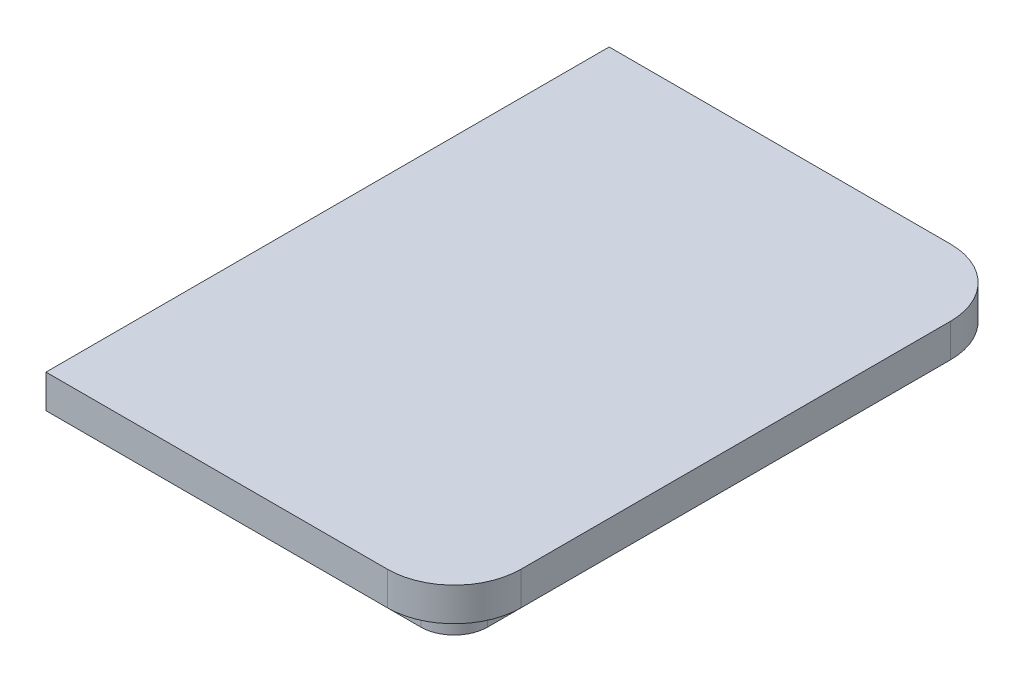
ISO-10303-21;
HEADER;
FILE_DESCRIPTION(('STEP AP214'),'2;1');
FILE_NAME('part.step','',(''),(''),'','','');
FILE_SCHEMA(('AUTOMOTIVE_DESIGN { 1 0 10303 214 1 1 1 1 }'));
ENDSEC;
DATA;
#1=APPLICATION_CONTEXT('core data for automotive mechanical design processes');
#2=APPLICATION_PROTOCOL_DEFINITION('international standard','automotive_design',2000,#1);
#3=PRODUCT_CONTEXT('',#1,'mechanical');
#4=PRODUCT('Part','Part','',(#3));
#5=PRODUCT_RELATED_PRODUCT_CATEGORY('part','',(#4));
#6=PRODUCT_DEFINITION_FORMATION('','',#4);
#7=PRODUCT_DEFINITION_CONTEXT('part definition',#1,'design');
#8=PRODUCT_DEFINITION('design','',#6,#7);
#9=PRODUCT_DEFINITION_SHAPE('','',#8);
#10=(LENGTH_UNIT() NAMED_UNIT(*) SI_UNIT(.MILLI.,.METRE.));
#11=(NAMED_UNIT(*) PLANE_ANGLE_UNIT() SI_UNIT($,.RADIAN.));
#12=(NAMED_UNIT(*) SI_UNIT($,.STERADIAN.) SOLID_ANGLE_UNIT());
#13=UNCERTAINTY_MEASURE_WITH_UNIT(LENGTH_MEASURE(1.E-05),#10,'distance_accuracy_value','');
#14=(GEOMETRIC_REPRESENTATION_CONTEXT(3) GLOBAL_UNCERTAINTY_ASSIGNED_CONTEXT((#13)) GLOBAL_UNIT_ASSIGNED_CONTEXT((#10,
#11,#12)) REPRESENTATION_CONTEXT('',''));
#15=CARTESIAN_POINT('',(0.,0.,0.));
#16=DIRECTION('',(0.,0.,1.));
#17=DIRECTION('',(1.,0.,0.));
#18=AXIS2_PLACEMENT_3D('',#15,#16,#17);
#19=CARTESIAN_POINT('',(20.5,0.,-32.075));
#20=DIRECTION('',(0.,1.,0.));
#21=DIRECTION('',(0.,0.,1.));
#22=AXIS2_PLACEMENT_3D('',#19,#20,#21);
#23=PLANE('',#22);
#24=DIRECTION('',(0.,0.,1.));
#25=VECTOR('',#24,1.);
#26=CARTESIAN_POINT('',(-30.5,0.,42.075));
#27=LINE('',#26,#25);
#28=CARTESIAN_POINT('',(-30.5,0.,37.075));
#29=VERTEX_POINT('',#28);
#30=CARTESIAN_POINT('',(-30.5,0.,42.075));
#31=VERTEX_POINT('',#30);
#32=EDGE_CURVE('E153',#29,#31,#27,.T.);
#33=ORIENTED_EDGE('',*,*,#32,.F.);
#34=DIRECTION('',(1.,0.,0.));
#35=VECTOR('',#34,1.);
#36=CARTESIAN_POINT('',(-30.5,0.,37.075));
#37=LINE('',#36,#35);
#38=CARTESIAN_POINT('',(20.5,0.,37.075));
#39=VERTEX_POINT('',#38);
#40=EDGE_CURVE('E258',#29,#39,#37,.T.);
#41=ORIENTED_EDGE('',*,*,#40,.T.);
#42=CARTESIAN_POINT('',(20.5,0.,32.075));
#43=DIRECTION('',(0.,1.,0.));
#44=DIRECTION('',(0.,0.,1.));
#45=AXIS2_PLACEMENT_3D('',#42,#43,#44);
#46=CIRCLE('',#45,5.);
#47=CARTESIAN_POINT('',(25.5,0.,32.075));
#48=VERTEX_POINT('',#47);
#49=EDGE_CURVE('E254',#39,#48,#46,.T.);
#50=ORIENTED_EDGE('',*,*,#49,.T.);
#51=DIRECTION('',(0.,0.,-1.));
#52=VECTOR('',#51,1.);
#53=CARTESIAN_POINT('',(25.5,0.,32.075));
#54=LINE('',#53,#52);
#55=CARTESIAN_POINT('',(25.5,0.,-32.075));
#56=VERTEX_POINT('',#55);
#57=EDGE_CURVE('E250',#48,#56,#54,.T.);
#58=ORIENTED_EDGE('',*,*,#57,.T.);
#59=CARTESIAN_POINT('',(20.5,0.,-32.075));
#60=DIRECTION('',(0.,1.,0.));
#61=DIRECTION('',(0.,0.,1.));
#62=AXIS2_PLACEMENT_3D('',#59,#60,#61);
#63=CIRCLE('',#62,5.);
#64=CARTESIAN_POINT('',(20.5,0.,-37.075));
#65=VERTEX_POINT('',#64);
#66=EDGE_CURVE('E246',#56,#65,#63,.T.);
#67=ORIENTED_EDGE('',*,*,#66,.T.);
#68=DIRECTION('',(-1.,0.,0.));
#69=VECTOR('',#68,1.);
#70=CARTESIAN_POINT('',(20.5,0.,-37.075));
#71=LINE('',#70,#69);
#72=CARTESIAN_POINT('',(-30.5,0.,-37.075));
#73=VERTEX_POINT('',#72);
#74=EDGE_CURVE('E242',#65,#73,#71,.T.);
#75=ORIENTED_EDGE('',*,*,#74,.T.);
#76=CARTESIAN_POINT('',(-30.5,0.,-42.075));
#77=VERTEX_POINT('',#76);
#78=EDGE_CURVE('E147',#77,#73,#27,.T.);
#79=ORIENTED_EDGE('',*,*,#78,.F.);
#80=DIRECTION('',(-1.,0.,0.));
#81=VECTOR('',#80,1.);
#82=CARTESIAN_POINT('',(-30.5,0.,-42.075));
#83=LINE('',#82,#81);
#84=CARTESIAN_POINT('',(20.5,0.,-42.075));
#85=VERTEX_POINT('',#84);
#86=EDGE_CURVE('E97',#85,#77,#83,.T.);
#87=ORIENTED_EDGE('',*,*,#86,.F.);
#88=CARTESIAN_POINT('',(20.5,0.,-32.075));
#89=DIRECTION('',(0.,1.,0.));
#90=DIRECTION('',(0.,0.,1.));
#91=AXIS2_PLACEMENT_3D('',#88,#89,#90);
#92=CIRCLE('',#91,10.);
#93=CARTESIAN_POINT('',(30.5,0.,-32.075));
#94=VERTEX_POINT('',#93);
#95=EDGE_CURVE('E161',#94,#85,#92,.T.);
#96=ORIENTED_EDGE('',*,*,#95,.F.);
#97=DIRECTION('',(0.,0.,-1.));
#98=VECTOR('',#97,1.);
#99=CARTESIAN_POINT('',(30.5,0.,32.075));
#100=LINE('',#99,#98);
#101=CARTESIAN_POINT('',(30.5,0.,32.075));
#102=VERTEX_POINT('',#101);
#103=EDGE_CURVE('E132',#102,#94,#100,.T.);
#104=ORIENTED_EDGE('',*,*,#103,.F.);
#105=CARTESIAN_POINT('',(20.5,0.,32.075));
#106=DIRECTION('',(0.,1.,0.));
#107=DIRECTION('',(0.,0.,1.));
#108=AXIS2_PLACEMENT_3D('',#105,#106,#107);
#109=CIRCLE('',#108,10.);
#110=CARTESIAN_POINT('',(20.5,0.,42.075));
#111=VERTEX_POINT('',#110);
#112=EDGE_CURVE('E156',#111,#102,#109,.T.);
#113=ORIENTED_EDGE('',*,*,#112,.F.);
#114=DIRECTION('',(1.,0.,0.));
#115=VECTOR('',#114,1.);
#116=CARTESIAN_POINT('',(-30.5,0.,42.075));
#117=LINE('',#116,#115);
#118=EDGE_CURVE('E151',#31,#111,#117,.T.);
#119=ORIENTED_EDGE('',*,*,#118,.F.);
#120=EDGE_LOOP('',(#33,#41,#50,#58,#67,#75,#79,#87,#96,#104,#113,#119));
#121=FACE_BOUND('',#120,.T.);
#122=ADVANCED_FACE('F45',(#121),#23,.F.);
#123=CARTESIAN_POINT('',(-30.5,5.,42.075));
#124=DIRECTION('',(1.,0.,0.));
#125=DIRECTION('',(0.,0.,-1.));
#126=AXIS2_PLACEMENT_3D('',#123,#124,#125);
#127=PLANE('',#126);
#128=ORIENTED_EDGE('',*,*,#78,.T.);
#129=DIRECTION('',(0.,1.,0.));
#130=VECTOR('',#129,1.);
#131=CARTESIAN_POINT('',(-30.5,-5.,-37.075));
#132=LINE('',#131,#130);
#133=CARTESIAN_POINT('',(-30.5,-5.,-37.075));
#134=VERTEX_POINT('',#133);
#135=EDGE_CURVE('E212',#134,#73,#132,.T.);
#136=ORIENTED_EDGE('',*,*,#135,.F.);
#137=DIRECTION('',(0.,0.,1.));
#138=VECTOR('',#137,1.);
#139=CARTESIAN_POINT('',(-30.5,-5.,-37.075));
#140=LINE('',#139,#138);
#141=CARTESIAN_POINT('',(-30.5,-5.,-32.075));
#142=VERTEX_POINT('',#141);
#143=EDGE_CURVE('E272',#134,#142,#140,.T.);
#144=ORIENTED_EDGE('',*,*,#143,.T.);
#145=DIRECTION('',(0.,1.,0.));
#146=VECTOR('',#145,1.);
#147=CARTESIAN_POINT('',(-30.5,-5.,-32.075));
#148=LINE('',#147,#146);
#149=CARTESIAN_POINT('',(-30.5,0.,-32.075));
#150=VERTEX_POINT('',#149);
#151=EDGE_CURVE('E216',#142,#150,#148,.T.);
#152=ORIENTED_EDGE('',*,*,#151,.T.);
#153=CARTESIAN_POINT('',(-30.5,0.,32.075));
#154=VERTEX_POINT('',#153);
#155=EDGE_CURVE('E152',#150,#154,#27,.T.);
#156=ORIENTED_EDGE('',*,*,#155,.T.);
#157=DIRECTION('',(0.,1.,0.));
#158=VECTOR('',#157,1.);
#159=CARTESIAN_POINT('',(-30.5,-5.,32.075));
#160=LINE('',#159,#158);
#161=CARTESIAN_POINT('',(-30.5,-5.,32.075));
#162=VERTEX_POINT('',#161);
#163=EDGE_CURVE('E61',#162,#154,#160,.T.);
#164=ORIENTED_EDGE('',*,*,#163,.F.);
#165=DIRECTION('',(0.,0.,1.));
#166=VECTOR('',#165,1.);
#167=CARTESIAN_POINT('',(-30.5,-5.,32.075));
#168=LINE('',#167,#166);
#169=CARTESIAN_POINT('',(-30.5,-5.,37.075));
#170=VERTEX_POINT('',#169);
#171=EDGE_CURVE('E233',#162,#170,#168,.T.);
#172=ORIENTED_EDGE('',*,*,#171,.T.);
#173=DIRECTION('',(0.,1.,0.));
#174=VECTOR('',#173,1.);
#175=CARTESIAN_POINT('',(-30.5,-5.,37.075));
#176=LINE('',#175,#174);
#177=EDGE_CURVE('E190',#170,#29,#176,.T.);
#178=ORIENTED_EDGE('',*,*,#177,.T.);
#179=ORIENTED_EDGE('',*,*,#32,.T.);
#180=DIRECTION('',(0.,-1.,0.));
#181=VECTOR('',#180,1.);
#182=CARTESIAN_POINT('',(-30.5,5.,42.075));
#183=LINE('',#182,#181);
#184=CARTESIAN_POINT('',(-30.5,5.,42.075));
#185=VERTEX_POINT('',#184);
#186=EDGE_CURVE('E11',#185,#31,#183,.T.);
#187=ORIENTED_EDGE('',*,*,#186,.F.);
#188=DIRECTION('',(0.,0.,1.));
#189=VECTOR('',#188,1.);
#190=CARTESIAN_POINT('',(-30.5,5.,42.075));
#191=LINE('',#190,#189);
#192=CARTESIAN_POINT('',(-30.5,5.,-42.075));
#193=VERTEX_POINT('',#192);
#194=EDGE_CURVE('E166',#193,#185,#191,.T.);
#195=ORIENTED_EDGE('',*,*,#194,.F.);
#196=DIRECTION('',(0.,-1.,0.));
#197=VECTOR('',#196,1.);
#198=CARTESIAN_POINT('',(-30.5,5.,-42.075));
#199=LINE('',#198,#197);
#200=EDGE_CURVE('E143',#193,#77,#199,.T.);
#201=ORIENTED_EDGE('',*,*,#200,.T.);
#202=EDGE_LOOP('',(#128,#136,#144,#152,#156,#164,#172,#178,#179,#187,#195,#201));
#203=FACE_BOUND('',#202,.T.);
#204=ADVANCED_FACE('F47',(#203),#127,.F.);
#205=CARTESIAN_POINT('',(-30.5,5.,42.075));
#206=DIRECTION('',(0.,0.,-1.));
#207=DIRECTION('',(-1.,0.,0.));
#208=AXIS2_PLACEMENT_3D('',#205,#206,#207);
#209=PLANE('',#208);
#210=ORIENTED_EDGE('',*,*,#118,.T.);
#211=DIRECTION('',(0.,-1.,0.));
#212=VECTOR('',#211,1.);
#213=CARTESIAN_POINT('',(20.5,5.,42.075));
#214=LINE('',#213,#212);
#215=CARTESIAN_POINT('',(20.5,5.,42.075));
#216=VERTEX_POINT('',#215);
#217=EDGE_CURVE('E54',#216,#111,#214,.T.);
#218=ORIENTED_EDGE('',*,*,#217,.F.);
#219=DIRECTION('',(1.,0.,0.));
#220=VECTOR('',#219,1.);
#221=CARTESIAN_POINT('',(-30.5,5.,42.075));
#222=LINE('',#221,#220);
#223=EDGE_CURVE('E105',#185,#216,#222,.T.);
#224=ORIENTED_EDGE('',*,*,#223,.F.);
#225=ORIENTED_EDGE('',*,*,#186,.T.);
#226=EDGE_LOOP('',(#210,#218,#224,#225));
#227=FACE_BOUND('',#226,.T.);
#228=ADVANCED_FACE('F394',(#227),#209,.F.);
#229=CARTESIAN_POINT('',(20.5,5.,32.075));
#230=DIRECTION('',(0.,-1.,0.));
#231=DIRECTION('',(0.,0.,-1.));
#232=AXIS2_PLACEMENT_3D('',#229,#230,#231);
#233=CYLINDRICAL_SURFACE('',#232,10.);
#234=ORIENTED_EDGE('',*,*,#112,.T.);
#235=DIRECTION('',(0.,-1.,0.));
#236=VECTOR('',#235,1.);
#237=CARTESIAN_POINT('',(30.5,5.,32.075));
#238=LINE('',#237,#236);
#239=CARTESIAN_POINT('',(30.5,5.,32.075));
#240=VERTEX_POINT('',#239);
#241=EDGE_CURVE('E136',#240,#102,#238,.T.);
#242=ORIENTED_EDGE('',*,*,#241,.F.);
#243=CARTESIAN_POINT('',(20.5,5.,32.075));
#244=DIRECTION('',(0.,1.,0.));
#245=DIRECTION('',(0.,0.,1.));
#246=AXIS2_PLACEMENT_3D('',#243,#244,#245);
#247=CIRCLE('',#246,10.);
#248=EDGE_CURVE('E122',#216,#240,#247,.T.);
#249=ORIENTED_EDGE('',*,*,#248,.F.);
#250=ORIENTED_EDGE('',*,*,#217,.T.);
#251=EDGE_LOOP('',(#234,#242,#249,#250));
#252=FACE_BOUND('',#251,.T.);
#253=ADVANCED_FACE('F176',(#252),#233,.T.);
#254=CARTESIAN_POINT('',(30.5,5.,32.075));
#255=DIRECTION('',(-1.,0.,0.));
#256=DIRECTION('',(0.,0.,1.));
#257=AXIS2_PLACEMENT_3D('',#254,#255,#256);
#258=PLANE('',#257);
#259=ORIENTED_EDGE('',*,*,#103,.T.);
#260=DIRECTION('',(0.,-1.,0.));
#261=VECTOR('',#260,1.);
#262=CARTESIAN_POINT('',(30.5,5.,-32.075));
#263=LINE('',#262,#261);
#264=CARTESIAN_POINT('',(30.5,5.,-32.075));
#265=VERTEX_POINT('',#264);
#266=EDGE_CURVE('E129',#265,#94,#263,.T.);
#267=ORIENTED_EDGE('',*,*,#266,.F.);
#268=DIRECTION('',(0.,0.,-1.));
#269=VECTOR('',#268,1.);
#270=CARTESIAN_POINT('',(30.5,5.,32.075));
#271=LINE('',#270,#269);
#272=EDGE_CURVE('E115',#240,#265,#271,.T.);
#273=ORIENTED_EDGE('',*,*,#272,.F.);
#274=ORIENTED_EDGE('',*,*,#241,.T.);
#275=EDGE_LOOP('',(#259,#267,#273,#274));
#276=FACE_BOUND('',#275,.T.);
#277=ADVANCED_FACE('F130',(#276),#258,.F.);
#278=CARTESIAN_POINT('',(20.5,5.,-32.075));
#279=DIRECTION('',(0.,-1.,0.));
#280=DIRECTION('',(0.,0.,-1.));
#281=AXIS2_PLACEMENT_3D('',#278,#279,#280);
#282=CYLINDRICAL_SURFACE('',#281,10.);
#283=ORIENTED_EDGE('',*,*,#95,.T.);
#284=DIRECTION('',(0.,-1.,0.));
#285=VECTOR('',#284,1.);
#286=CARTESIAN_POINT('',(20.5,5.,-42.075));
#287=LINE('',#286,#285);
#288=CARTESIAN_POINT('',(20.5,5.,-42.075));
#289=VERTEX_POINT('',#288);
#290=EDGE_CURVE('E137',#289,#85,#287,.T.);
#291=ORIENTED_EDGE('',*,*,#290,.F.);
#292=CARTESIAN_POINT('',(20.5,5.,-32.075));
#293=DIRECTION('',(0.,1.,0.));
#294=DIRECTION('',(0.,0.,1.));
#295=AXIS2_PLACEMENT_3D('',#292,#293,#294);
#296=CIRCLE('',#295,10.);
#297=EDGE_CURVE('E119',#265,#289,#296,.T.);
#298=ORIENTED_EDGE('',*,*,#297,.F.);
#299=ORIENTED_EDGE('',*,*,#266,.T.);
#300=EDGE_LOOP('',(#283,#291,#298,#299));
#301=FACE_BOUND('',#300,.T.);
#302=ADVANCED_FACE('F139',(#301),#282,.T.);
#303=CARTESIAN_POINT('',(-30.5,5.,-42.075));
#304=DIRECTION('',(0.,0.,1.));
#305=DIRECTION('',(1.,0.,0.));
#306=AXIS2_PLACEMENT_3D('',#303,#304,#305);
#307=PLANE('',#306);
#308=ORIENTED_EDGE('',*,*,#86,.T.);
#309=ORIENTED_EDGE('',*,*,#200,.F.);
#310=DIRECTION('',(-1.,0.,0.));
#311=VECTOR('',#310,1.);
#312=CARTESIAN_POINT('',(-30.5,5.,-42.075));
#313=LINE('',#312,#311);
#314=EDGE_CURVE('E70',#289,#193,#313,.T.);
#315=ORIENTED_EDGE('',*,*,#314,.F.);
#316=ORIENTED_EDGE('',*,*,#290,.T.);
#317=EDGE_LOOP('',(#308,#309,#315,#316));
#318=FACE_BOUND('',#317,.T.);
#319=ADVANCED_FACE('F181',(#318),#307,.F.);
#320=CARTESIAN_POINT('',(20.5,5.,-32.075));
#321=DIRECTION('',(0.,1.,0.));
#322=DIRECTION('',(0.,0.,1.));
#323=AXIS2_PLACEMENT_3D('',#320,#321,#322);
#324=PLANE('',#323);
#325=ORIENTED_EDGE('',*,*,#194,.T.);
#326=ORIENTED_EDGE('',*,*,#223,.T.);
#327=ORIENTED_EDGE('',*,*,#248,.T.);
#328=ORIENTED_EDGE('',*,*,#272,.T.);
#329=ORIENTED_EDGE('',*,*,#297,.T.);
#330=ORIENTED_EDGE('',*,*,#314,.T.);
#331=EDGE_LOOP('',(#325,#326,#327,#328,#329,#330));
#332=FACE_BOUND('',#331,.T.);
#333=ADVANCED_FACE('F117',(#332),#324,.T.);
#334=ORIENTED_EDGE('',*,*,#155,.F.);
#335=DIRECTION('',(1.,0.,0.));
#336=VECTOR('',#335,1.);
#337=CARTESIAN_POINT('',(20.5,0.,-32.075));
#338=LINE('',#337,#336);
#339=CARTESIAN_POINT('',(20.5,0.,-32.075));
#340=VERTEX_POINT('',#339);
#341=EDGE_CURVE('E238',#150,#340,#338,.T.);
#342=ORIENTED_EDGE('',*,*,#341,.T.);
#343=DIRECTION('',(0.,0.,1.));
#344=VECTOR('',#343,1.);
#345=CARTESIAN_POINT('',(20.5,0.,32.075));
#346=LINE('',#345,#344);
#347=CARTESIAN_POINT('',(20.5,0.,32.075));
#348=VERTEX_POINT('',#347);
#349=EDGE_CURVE('E234',#340,#348,#346,.T.);
#350=ORIENTED_EDGE('',*,*,#349,.T.);
#351=DIRECTION('',(-1.,0.,0.));
#352=VECTOR('',#351,1.);
#353=CARTESIAN_POINT('',(-30.5,0.,32.075));
#354=LINE('',#353,#352);
#355=EDGE_CURVE('E230',#348,#154,#354,.T.);
#356=ORIENTED_EDGE('',*,*,#355,.T.);
#357=EDGE_LOOP('',(#334,#342,#350,#356));
#358=FACE_BOUND('',#357,.T.);
#359=ADVANCED_FACE('F389',(#358),#23,.F.);
#360=CARTESIAN_POINT('',(-30.5,-5.,32.075));
#361=DIRECTION('',(0.,0.,-1.));
#362=DIRECTION('',(-1.,0.,0.));
#363=AXIS2_PLACEMENT_3D('',#360,#361,#362);
#364=PLANE('',#363);
#365=ORIENTED_EDGE('',*,*,#355,.F.);
#366=DIRECTION('',(0.,1.,0.));
#367=VECTOR('',#366,1.);
#368=CARTESIAN_POINT('',(20.5,-5.,32.075));
#369=LINE('',#368,#367);
#370=CARTESIAN_POINT('',(20.5,-5.,32.075));
#371=VERTEX_POINT('',#370);
#372=EDGE_CURVE('E224',#371,#348,#369,.T.);
#373=ORIENTED_EDGE('',*,*,#372,.F.);
#374=DIRECTION('',(-1.,0.,0.));
#375=VECTOR('',#374,1.);
#376=CARTESIAN_POINT('',(-30.5,-5.,32.075));
#377=LINE('',#376,#375);
#378=EDGE_CURVE('E196',#371,#162,#377,.T.);
#379=ORIENTED_EDGE('',*,*,#378,.T.);
#380=ORIENTED_EDGE('',*,*,#163,.T.);
#381=EDGE_LOOP('',(#365,#373,#379,#380));
#382=FACE_BOUND('',#381,.T.);
#383=ADVANCED_FACE('F315',(#382),#364,.T.);
#384=CARTESIAN_POINT('',(20.5,-5.,32.075));
#385=DIRECTION('',(-1.,0.,0.));
#386=DIRECTION('',(0.,0.,1.));
#387=AXIS2_PLACEMENT_3D('',#384,#385,#386);
#388=PLANE('',#387);
#389=ORIENTED_EDGE('',*,*,#349,.F.);
#390=DIRECTION('',(0.,1.,0.));
#391=VECTOR('',#390,1.);
#392=CARTESIAN_POINT('',(20.5,-5.,-32.075));
#393=LINE('',#392,#391);
#394=CARTESIAN_POINT('',(20.5,-5.,-32.075));
#395=VERTEX_POINT('',#394);
#396=EDGE_CURVE('E220',#395,#340,#393,.T.);
#397=ORIENTED_EDGE('',*,*,#396,.F.);
#398=DIRECTION('',(0.,0.,1.));
#399=VECTOR('',#398,1.);
#400=CARTESIAN_POINT('',(20.5,-5.,32.075));
#401=LINE('',#400,#399);
#402=EDGE_CURVE('E264',#395,#371,#401,.T.);
#403=ORIENTED_EDGE('',*,*,#402,.T.);
#404=ORIENTED_EDGE('',*,*,#372,.T.);
#405=EDGE_LOOP('',(#389,#397,#403,#404));
#406=FACE_BOUND('',#405,.T.);
#407=ADVANCED_FACE('F321',(#406),#388,.T.);
#408=CARTESIAN_POINT('',(20.5,-5.,-32.075));
#409=DIRECTION('',(0.,0.,1.));
#410=DIRECTION('',(1.,0.,0.));
#411=AXIS2_PLACEMENT_3D('',#408,#409,#410);
#412=PLANE('',#411);
#413=ORIENTED_EDGE('',*,*,#341,.F.);
#414=ORIENTED_EDGE('',*,*,#151,.F.);
#415=DIRECTION('',(1.,0.,0.));
#416=VECTOR('',#415,1.);
#417=CARTESIAN_POINT('',(20.5,-5.,-32.075));
#418=LINE('',#417,#416);
#419=EDGE_CURVE('E268',#142,#395,#418,.T.);
#420=ORIENTED_EDGE('',*,*,#419,.T.);
#421=ORIENTED_EDGE('',*,*,#396,.T.);
#422=EDGE_LOOP('',(#413,#414,#420,#421));
#423=FACE_BOUND('',#422,.T.);
#424=ADVANCED_FACE('F329',(#423),#412,.T.);
#425=CARTESIAN_POINT('',(20.5,-5.,-37.075));
#426=DIRECTION('',(0.,0.,-1.));
#427=DIRECTION('',(-1.,0.,0.));
#428=AXIS2_PLACEMENT_3D('',#425,#426,#427);
#429=PLANE('',#428);
#430=ORIENTED_EDGE('',*,*,#74,.F.);
#431=DIRECTION('',(0.,1.,0.));
#432=VECTOR('',#431,1.);
#433=CARTESIAN_POINT('',(20.5,-5.,-37.075));
#434=LINE('',#433,#432);
#435=CARTESIAN_POINT('',(20.5,-5.,-37.075));
#436=VERTEX_POINT('',#435);
#437=EDGE_CURVE('E208',#436,#65,#434,.T.);
#438=ORIENTED_EDGE('',*,*,#437,.F.);
#439=DIRECTION('',(-1.,0.,0.));
#440=VECTOR('',#439,1.);
#441=CARTESIAN_POINT('',(20.5,-5.,-37.075));
#442=LINE('',#441,#440);
#443=EDGE_CURVE('E276',#436,#134,#442,.T.);
#444=ORIENTED_EDGE('',*,*,#443,.T.);
#445=ORIENTED_EDGE('',*,*,#135,.T.);
#446=EDGE_LOOP('',(#430,#438,#444,#445));
#447=FACE_BOUND('',#446,.T.);
#448=ADVANCED_FACE('F378',(#447),#429,.T.);
#449=CARTESIAN_POINT('',(20.5,-5.,-32.075));
#450=DIRECTION('',(0.,1.,0.));
#451=DIRECTION('',(0.,0.,1.));
#452=AXIS2_PLACEMENT_3D('',#449,#450,#451);
#453=CYLINDRICAL_SURFACE('',#452,5.);
#454=ORIENTED_EDGE('',*,*,#66,.F.);
#455=DIRECTION('',(0.,1.,0.));
#456=VECTOR('',#455,1.);
#457=CARTESIAN_POINT('',(25.5,-5.,-32.075));
#458=LINE('',#457,#456);
#459=CARTESIAN_POINT('',(25.5,-5.,-32.075));
#460=VERTEX_POINT('',#459);
#461=EDGE_CURVE('E204',#460,#56,#458,.T.);
#462=ORIENTED_EDGE('',*,*,#461,.F.);
#463=CARTESIAN_POINT('',(20.5,-5.,-32.075));
#464=DIRECTION('',(0.,1.,0.));
#465=DIRECTION('',(0.,0.,1.));
#466=AXIS2_PLACEMENT_3D('',#463,#464,#465);
#467=CIRCLE('',#466,5.);
#468=EDGE_CURVE('E280',#460,#436,#467,.T.);
#469=ORIENTED_EDGE('',*,*,#468,.T.);
#470=ORIENTED_EDGE('',*,*,#437,.T.);
#471=EDGE_LOOP('',(#454,#462,#469,#470));
#472=FACE_BOUND('',#471,.T.);
#473=ADVANCED_FACE('F374',(#472),#453,.T.);
#474=CARTESIAN_POINT('',(25.5,-5.,32.075));
#475=DIRECTION('',(1.,0.,0.));
#476=DIRECTION('',(0.,0.,-1.));
#477=AXIS2_PLACEMENT_3D('',#474,#475,#476);
#478=PLANE('',#477);
#479=ORIENTED_EDGE('',*,*,#57,.F.);
#480=DIRECTION('',(0.,1.,0.));
#481=VECTOR('',#480,1.);
#482=CARTESIAN_POINT('',(25.5,-5.,32.075));
#483=LINE('',#482,#481);
#484=CARTESIAN_POINT('',(25.5,-5.,32.075));
#485=VERTEX_POINT('',#484);
#486=EDGE_CURVE('E200',#485,#48,#483,.T.);
#487=ORIENTED_EDGE('',*,*,#486,.F.);
#488=DIRECTION('',(0.,0.,-1.));
#489=VECTOR('',#488,1.);
#490=CARTESIAN_POINT('',(25.5,-5.,32.075));
#491=LINE('',#490,#489);
#492=EDGE_CURVE('E284',#485,#460,#491,.T.);
#493=ORIENTED_EDGE('',*,*,#492,.T.);
#494=ORIENTED_EDGE('',*,*,#461,.T.);
#495=EDGE_LOOP('',(#479,#487,#493,#494));
#496=FACE_BOUND('',#495,.T.);
#497=ADVANCED_FACE('F372',(#496),#478,.T.);
#498=CARTESIAN_POINT('',(20.5,-5.,32.075));
#499=DIRECTION('',(0.,1.,0.));
#500=DIRECTION('',(0.,0.,1.));
#501=AXIS2_PLACEMENT_3D('',#498,#499,#500);
#502=CYLINDRICAL_SURFACE('',#501,5.);
#503=ORIENTED_EDGE('',*,*,#49,.F.);
#504=DIRECTION('',(0.,1.,0.));
#505=VECTOR('',#504,1.);
#506=CARTESIAN_POINT('',(20.5,-5.,37.075));
#507=LINE('',#506,#505);
#508=CARTESIAN_POINT('',(20.5,-5.,37.075));
#509=VERTEX_POINT('',#508);
#510=EDGE_CURVE('E195',#509,#39,#507,.T.);
#511=ORIENTED_EDGE('',*,*,#510,.F.);
#512=CARTESIAN_POINT('',(20.5,-5.,32.075));
#513=DIRECTION('',(0.,1.,0.));
#514=DIRECTION('',(0.,0.,1.));
#515=AXIS2_PLACEMENT_3D('',#512,#513,#514);
#516=CIRCLE('',#515,5.);
#517=EDGE_CURVE('E288',#509,#485,#516,.T.);
#518=ORIENTED_EDGE('',*,*,#517,.T.);
#519=ORIENTED_EDGE('',*,*,#486,.T.);
#520=EDGE_LOOP('',(#503,#511,#518,#519));
#521=FACE_BOUND('',#520,.T.);
#522=ADVANCED_FACE('F362',(#521),#502,.T.);
#523=CARTESIAN_POINT('',(-30.5,-5.,37.075));
#524=DIRECTION('',(0.,0.,1.));
#525=DIRECTION('',(1.,0.,0.));
#526=AXIS2_PLACEMENT_3D('',#523,#524,#525);
#527=PLANE('',#526);
#528=ORIENTED_EDGE('',*,*,#40,.F.);
#529=ORIENTED_EDGE('',*,*,#177,.F.);
#530=DIRECTION('',(1.,0.,0.));
#531=VECTOR('',#530,1.);
#532=CARTESIAN_POINT('',(-30.5,-5.,37.075));
#533=LINE('',#532,#531);
#534=EDGE_CURVE('E292',#170,#509,#533,.T.);
#535=ORIENTED_EDGE('',*,*,#534,.T.);
#536=ORIENTED_EDGE('',*,*,#510,.T.);
#537=EDGE_LOOP('',(#528,#529,#535,#536));
#538=FACE_BOUND('',#537,.T.);
#539=ADVANCED_FACE('F366',(#538),#527,.T.);
#540=CARTESIAN_POINT('',(20.5,-5.,32.075));
#541=DIRECTION('',(0.,1.,0.));
#542=DIRECTION('',(0.,0.,1.));
#543=AXIS2_PLACEMENT_3D('',#540,#541,#542);
#544=PLANE('',#543);
#545=ORIENTED_EDGE('',*,*,#171,.F.);
#546=ORIENTED_EDGE('',*,*,#378,.F.);
#547=ORIENTED_EDGE('',*,*,#402,.F.);
#548=ORIENTED_EDGE('',*,*,#419,.F.);
#549=ORIENTED_EDGE('',*,*,#143,.F.);
#550=ORIENTED_EDGE('',*,*,#443,.F.);
#551=ORIENTED_EDGE('',*,*,#468,.F.);
#552=ORIENTED_EDGE('',*,*,#492,.F.);
#553=ORIENTED_EDGE('',*,*,#517,.F.);
#554=ORIENTED_EDGE('',*,*,#534,.F.);
#555=EDGE_LOOP('',(#545,#546,#547,#548,#549,#550,#551,#552,#553,#554));
#556=FACE_BOUND('',#555,.T.);
#557=ADVANCED_FACE('F309',(#556),#544,.F.);
#558=CLOSED_SHELL('',(#122,#204,#228,#253,#277,#302,#319,#333,#359,#383,#407,#424,#448,#473,
#497,#522,#539,#557));
#559=MANIFOLD_SOLID_BREP('B2',#558);
#560=ADVANCED_BREP_SHAPE_REPRESENTATION('',(#18,#559),#14);
#561=SHAPE_DEFINITION_REPRESENTATION(#9,#560);
ENDSEC;
END-ISO-10303-21;
